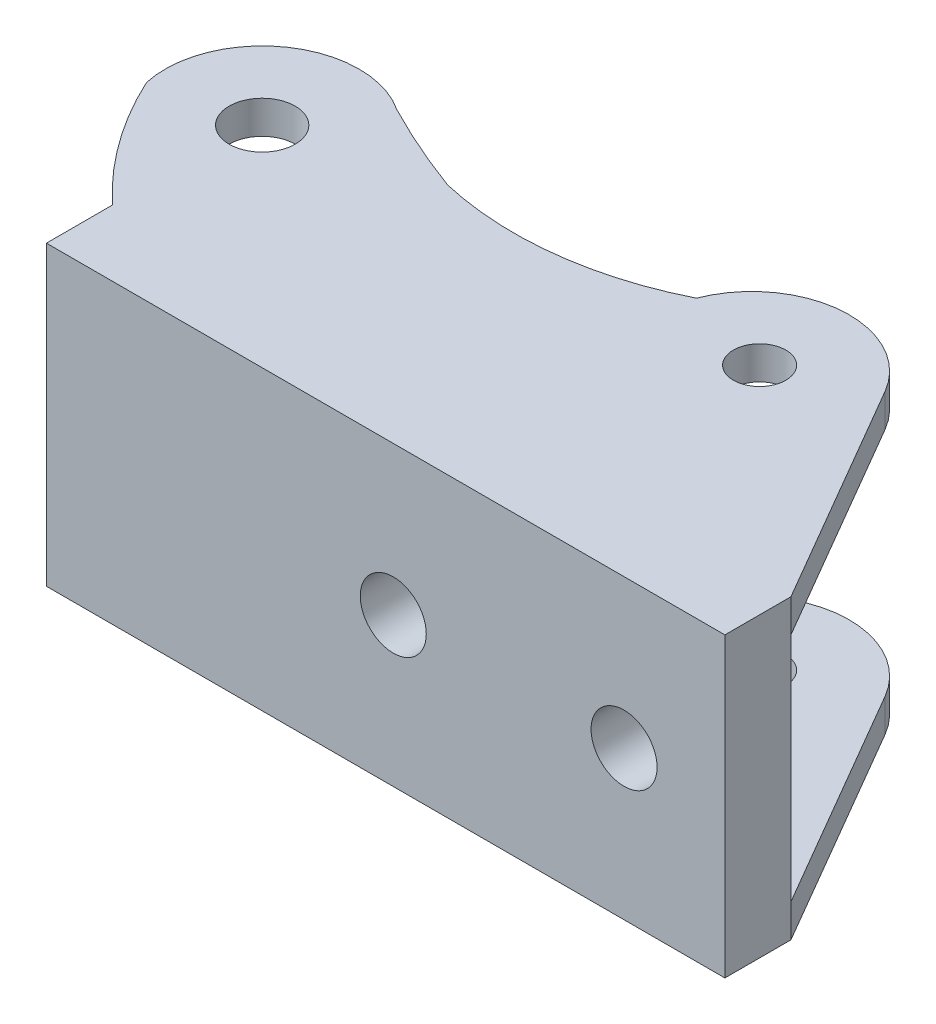
ISO-10303-21;
HEADER;
FILE_DESCRIPTION(('STEP AP214'),'2;1');
FILE_NAME('part.step','',(''),(''),'','','');
FILE_SCHEMA(('AUTOMOTIVE_DESIGN { 1 0 10303 214 1 1 1 1 }'));
ENDSEC;
DATA;
#1=APPLICATION_CONTEXT('core data for automotive mechanical design processes');
#2=APPLICATION_PROTOCOL_DEFINITION('international standard','automotive_design',2000,#1);
#3=PRODUCT_CONTEXT('',#1,'mechanical');
#4=PRODUCT('Part','Part','',(#3));
#5=PRODUCT_RELATED_PRODUCT_CATEGORY('part','',(#4));
#6=PRODUCT_DEFINITION_FORMATION('','',#4);
#7=PRODUCT_DEFINITION_CONTEXT('part definition',#1,'design');
#8=PRODUCT_DEFINITION('design','',#6,#7);
#9=PRODUCT_DEFINITION_SHAPE('','',#8);
#10=(LENGTH_UNIT() NAMED_UNIT(*) SI_UNIT(.MILLI.,.METRE.));
#11=(NAMED_UNIT(*) PLANE_ANGLE_UNIT() SI_UNIT($,.RADIAN.));
#12=(NAMED_UNIT(*) SI_UNIT($,.STERADIAN.) SOLID_ANGLE_UNIT());
#13=UNCERTAINTY_MEASURE_WITH_UNIT(LENGTH_MEASURE(1.E-05),#10,'distance_accuracy_value','');
#14=(GEOMETRIC_REPRESENTATION_CONTEXT(3) GLOBAL_UNCERTAINTY_ASSIGNED_CONTEXT((#13)) GLOBAL_UNIT_ASSIGNED_CONTEXT((#10,
#11,#12)) REPRESENTATION_CONTEXT('',''));
#15=CARTESIAN_POINT('',(0.,0.,0.));
#16=DIRECTION('',(0.,0.,1.));
#17=DIRECTION('',(1.,0.,0.));
#18=AXIS2_PLACEMENT_3D('',#15,#16,#17);
#19=CARTESIAN_POINT('',(0.,0.,10.));
#20=DIRECTION('',(0.,0.,-1.));
#21=DIRECTION('',(-1.,0.,0.));
#22=AXIS2_PLACEMENT_3D('',#19,#20,#21);
#23=PLANE('',#22);
#24=DIRECTION('',(0.,-1.,0.));
#25=VECTOR('',#24,1.);
#26=CARTESIAN_POINT('',(-70.,-22.5,10.));
#27=LINE('',#26,#25);
#28=CARTESIAN_POINT('',(-70.,22.5,10.));
#29=VERTEX_POINT('',#28);
#30=CARTESIAN_POINT('',(-70.,-22.5,10.));
#31=VERTEX_POINT('',#30);
#32=EDGE_CURVE('E62',#29,#31,#27,.T.);
#33=ORIENTED_EDGE('',*,*,#32,.T.);
#34=DIRECTION('',(1.,0.,0.));
#35=VECTOR('',#34,1.);
#36=CARTESIAN_POINT('',(32.7413623701842,-22.5,10.));
#37=LINE('',#36,#35);
#38=CARTESIAN_POINT('',(32.7413623701842,-22.5,10.));
#39=VERTEX_POINT('',#38);
#40=EDGE_CURVE('E117',#31,#39,#37,.T.);
#41=ORIENTED_EDGE('',*,*,#40,.T.);
#42=DIRECTION('',(0.,1.,0.));
#43=VECTOR('',#42,1.);
#44=CARTESIAN_POINT('',(32.7413623701842,22.5,10.));
#45=LINE('',#44,#43);
#46=CARTESIAN_POINT('',(32.7413623701842,22.5,10.));
#47=VERTEX_POINT('',#46);
#48=EDGE_CURVE('E110',#39,#47,#45,.T.);
#49=ORIENTED_EDGE('',*,*,#48,.T.);
#50=DIRECTION('',(-1.,0.,0.));
#51=VECTOR('',#50,1.);
#52=CARTESIAN_POINT('',(-70.,22.5,10.));
#53=LINE('',#52,#51);
#54=EDGE_CURVE('E114',#47,#29,#53,.T.);
#55=ORIENTED_EDGE('',*,*,#54,.T.);
#56=EDGE_LOOP('',(#33,#41,#49,#55));
#57=FACE_BOUND('',#56,.T.);
#58=CARTESIAN_POINT('',(-17.475,0.,10.));
#59=DIRECTION('',(0.,0.,1.));
#60=DIRECTION('',(1.,0.,0.));
#61=AXIS2_PLACEMENT_3D('',#58,#59,#60);
#62=CIRCLE('',#61,5.);
#63=CARTESIAN_POINT('',(-12.475,0.,10.));
#64=VERTEX_POINT('',#63);
#65=EDGE_CURVE('E160',#64,#64,#62,.T.);
#66=ORIENTED_EDGE('',*,*,#65,.F.);
#67=EDGE_LOOP('',(#66));
#68=FACE_BOUND('',#67,.T.);
#69=CARTESIAN_POINT('',(17.475,0.,10.));
#70=DIRECTION('',(0.,0.,1.));
#71=DIRECTION('',(1.,0.,0.));
#72=AXIS2_PLACEMENT_3D('',#69,#70,#71);
#73=CIRCLE('',#72,5.);
#74=CARTESIAN_POINT('',(22.475,0.,10.));
#75=VERTEX_POINT('',#74);
#76=EDGE_CURVE('E161',#75,#75,#73,.T.);
#77=ORIENTED_EDGE('',*,*,#76,.F.);
#78=EDGE_LOOP('',(#77));
#79=FACE_BOUND('',#78,.T.);
#80=ADVANCED_FACE('F38',(#57,#68,#79),#23,.F.);
#81=CARTESIAN_POINT('',(0.,0.,0.));
#82=DIRECTION('',(0.,0.,-1.));
#83=DIRECTION('',(-1.,0.,0.));
#84=AXIS2_PLACEMENT_3D('',#81,#82,#83);
#85=PLANE('',#84);
#86=DIRECTION('',(1.,0.,0.));
#87=VECTOR('',#86,1.);
#88=CARTESIAN_POINT('',(0.,-17.5,0.));
#89=LINE('',#88,#87);
#90=CARTESIAN_POINT('',(-70.,-17.5,0.));
#91=VERTEX_POINT('',#90);
#92=CARTESIAN_POINT('',(32.7413623701842,-17.5,0.));
#93=VERTEX_POINT('',#92);
#94=EDGE_CURVE('E223',#91,#93,#89,.T.);
#95=ORIENTED_EDGE('',*,*,#94,.F.);
#96=DIRECTION('',(0.,-1.,0.));
#97=VECTOR('',#96,1.);
#98=CARTESIAN_POINT('',(-70.,-22.5,0.));
#99=LINE('',#98,#97);
#100=CARTESIAN_POINT('',(-70.,17.5,0.));
#101=VERTEX_POINT('',#100);
#102=EDGE_CURVE('E142',#101,#91,#99,.T.);
#103=ORIENTED_EDGE('',*,*,#102,.F.);
#104=DIRECTION('',(-1.,0.,0.));
#105=VECTOR('',#104,1.);
#106=CARTESIAN_POINT('',(0.,17.5,0.));
#107=LINE('',#106,#105);
#108=CARTESIAN_POINT('',(32.7413623701842,17.5,0.));
#109=VERTEX_POINT('',#108);
#110=EDGE_CURVE('E167',#109,#101,#107,.T.);
#111=ORIENTED_EDGE('',*,*,#110,.F.);
#112=DIRECTION('',(0.,1.,0.));
#113=VECTOR('',#112,1.);
#114=CARTESIAN_POINT('',(32.7413623701842,22.5,0.));
#115=LINE('',#114,#113);
#116=EDGE_CURVE('E143',#93,#109,#115,.T.);
#117=ORIENTED_EDGE('',*,*,#116,.F.);
#118=EDGE_LOOP('',(#95,#103,#111,#117));
#119=FACE_BOUND('',#118,.T.);
#120=CARTESIAN_POINT('',(-17.475,0.,0.));
#121=DIRECTION('',(0.,0.,1.));
#122=DIRECTION('',(1.,0.,0.));
#123=AXIS2_PLACEMENT_3D('',#120,#121,#122);
#124=CIRCLE('',#123,5.);
#125=CARTESIAN_POINT('',(-12.475,0.,0.));
#126=VERTEX_POINT('',#125);
#127=EDGE_CURVE('E157',#126,#126,#124,.T.);
#128=ORIENTED_EDGE('',*,*,#127,.T.);
#129=EDGE_LOOP('',(#128));
#130=FACE_BOUND('',#129,.T.);
#131=CARTESIAN_POINT('',(17.475,0.,0.));
#132=DIRECTION('',(0.,0.,1.));
#133=DIRECTION('',(1.,0.,0.));
#134=AXIS2_PLACEMENT_3D('',#131,#132,#133);
#135=CIRCLE('',#134,5.);
#136=CARTESIAN_POINT('',(22.475,0.,0.));
#137=VERTEX_POINT('',#136);
#138=EDGE_CURVE('E164',#137,#137,#135,.T.);
#139=ORIENTED_EDGE('',*,*,#138,.T.);
#140=EDGE_LOOP('',(#139));
#141=FACE_BOUND('',#140,.T.);
#142=ADVANCED_FACE('F313',(#119,#130,#141),#85,.T.);
#143=CARTESIAN_POINT('',(32.7413623701842,-22.5,10.));
#144=DIRECTION('',(0.,1.,0.));
#145=DIRECTION('',(0.,0.,1.));
#146=AXIS2_PLACEMENT_3D('',#143,#144,#145);
#147=PLANE('',#146);
#148=DIRECTION('',(0.,0.,-1.));
#149=VECTOR('',#148,1.);
#150=CARTESIAN_POINT('',(-70.,-22.5,10.));
#151=LINE('',#150,#149);
#152=CARTESIAN_POINT('',(-70.,-22.5,0.));
#153=VERTEX_POINT('',#152);
#154=EDGE_CURVE('E135',#31,#153,#151,.T.);
#155=ORIENTED_EDGE('',*,*,#154,.T.);
#156=CARTESIAN_POINT('',(-29.033773091917,-22.5,-43.8379772904209));
#157=DIRECTION('',(0.,1.,0.));
#158=DIRECTION('',(0.,0.,-1.));
#159=AXIS2_PLACEMENT_3D('',#156,#157,#158);
#160=CIRCLE('',#159,60.);
#161=CARTESIAN_POINT('',(-83.493041421276,-22.5,-18.6548858791014));
#162=VERTEX_POINT('',#161);
#163=EDGE_CURVE('E75',#162,#153,#160,.T.);
#164=ORIENTED_EDGE('',*,*,#163,.F.);
#165=CARTESIAN_POINT('',(-69.1356503678922,-22.5,-21.8099536763849));
#166=DIRECTION('',(0.,1.,0.));
#167=DIRECTION('',(0.,0.,-1.));
#168=AXIS2_PLACEMENT_3D('',#165,#166,#167);
#169=CIRCLE('',#168,14.6999704307608);
#170=CARTESIAN_POINT('',(-60.9969388294074,-22.5,-34.0512977675611));
#171=VERTEX_POINT('',#170);
#172=EDGE_CURVE('E257',#171,#162,#169,.T.);
#173=ORIENTED_EDGE('',*,*,#172,.F.);
#174=CARTESIAN_POINT('',(-5.78861808199234,-22.5,-140.962108398092));
#175=DIRECTION('',(0.,-1.,0.));
#176=DIRECTION('',(0.,0.,1.));
#177=AXIS2_PLACEMENT_3D('',#174,#175,#176);
#178=CIRCLE('',#177,120.324062886135);
#179=CARTESIAN_POINT('',(-47.2306520051049,-22.5,-28.));
#180=VERTEX_POINT('',#179);
#181=EDGE_CURVE('E254',#180,#171,#178,.T.);
#182=ORIENTED_EDGE('',*,*,#181,.F.);
#183=CARTESIAN_POINT('',(-35.952206015475,-22.5,-76.7113606467629));
#184=DIRECTION('',(0.,-1.,0.));
#185=DIRECTION('',(0.,0.,1.));
#186=AXIS2_PLACEMENT_3D('',#183,#184,#185);
#187=CIRCLE('',#186,50.);
#188=CARTESIAN_POINT('',(-13.5715396019139,-22.5,-32.));
#189=VERTEX_POINT('',#188);
#190=EDGE_CURVE('E251',#189,#180,#187,.T.);
#191=ORIENTED_EDGE('',*,*,#190,.F.);
#192=CARTESIAN_POINT('',(0.179908217906623,-22.5,-26.6307273203205));
#193=DIRECTION('',(0.,1.,0.));
#194=DIRECTION('',(0.,0.,1.));
#195=AXIS2_PLACEMENT_3D('',#192,#193,#194);
#196=CIRCLE('',#195,14.7625);
#197=CARTESIAN_POINT('',(12.9418258045211,-22.5,-34.0512977675611));
#198=VERTEX_POINT('',#197);
#199=EDGE_CURVE('E248',#198,#189,#196,.T.);
#200=ORIENTED_EDGE('',*,*,#199,.F.);
#201=DIRECTION('',(-0.50266353579953,0.,-0.864482139652124));
#202=VECTOR('',#201,1.);
#203=CARTESIAN_POINT('',(32.7413623701842,-22.5,0.));
#204=LINE('',#203,#202);
#205=CARTESIAN_POINT('',(32.7413623701842,-22.5,0.));
#206=VERTEX_POINT('',#205);
#207=EDGE_CURVE('E244',#206,#198,#204,.T.);
#208=ORIENTED_EDGE('',*,*,#207,.F.);
#209=DIRECTION('',(0.,0.,-1.));
#210=VECTOR('',#209,1.);
#211=CARTESIAN_POINT('',(32.7413623701842,-22.5,10.));
#212=LINE('',#211,#210);
#213=EDGE_CURVE('E11',#39,#206,#212,.T.);
#214=ORIENTED_EDGE('',*,*,#213,.F.);
#215=ORIENTED_EDGE('',*,*,#40,.F.);
#216=EDGE_LOOP('',(#155,#164,#173,#182,#191,#200,#208,#214,#215));
#217=FACE_BOUND('',#216,.T.);
#218=CARTESIAN_POINT('',(0.,-22.5,-28.));
#219=DIRECTION('',(0.,1.,0.));
#220=DIRECTION('',(0.,0.,1.));
#221=AXIS2_PLACEMENT_3D('',#218,#219,#220);
#222=CIRCLE('',#221,3.96875);
#223=CARTESIAN_POINT('',(0.,-22.5,-24.03125));
#224=VERTEX_POINT('',#223);
#225=EDGE_CURVE('E278',#224,#224,#222,.T.);
#226=ORIENTED_EDGE('',*,*,#225,.T.);
#227=EDGE_LOOP('',(#226));
#228=FACE_BOUND('',#227,.T.);
#229=CARTESIAN_POINT('',(-69.1356503678922,-22.5,-21.8099536763849));
#230=DIRECTION('',(0.,1.,0.));
#231=DIRECTION('',(0.,0.,1.));
#232=AXIS2_PLACEMENT_3D('',#229,#230,#231);
#233=CIRCLE('',#232,5.00000000000002);
#234=CARTESIAN_POINT('',(-69.1356503678922,-22.5,-16.8099536763849));
#235=VERTEX_POINT('',#234);
#236=EDGE_CURVE('E284',#235,#235,#233,.T.);
#237=ORIENTED_EDGE('',*,*,#236,.T.);
#238=EDGE_LOOP('',(#237));
#239=FACE_BOUND('',#238,.T.);
#240=ADVANCED_FACE('F40',(#217,#228,#239),#147,.F.);
#241=CARTESIAN_POINT('',(32.7413623701842,22.5,10.));
#242=DIRECTION('',(-1.,0.,0.));
#243=DIRECTION('',(0.,0.,1.));
#244=AXIS2_PLACEMENT_3D('',#241,#242,#243);
#245=PLANE('',#244);
#246=DIRECTION('',(0.,0.,-1.));
#247=VECTOR('',#246,1.);
#248=CARTESIAN_POINT('',(32.7413623701842,22.5,10.));
#249=LINE('',#248,#247);
#250=CARTESIAN_POINT('',(32.7413623701842,22.5,0.));
#251=VERTEX_POINT('',#250);
#252=EDGE_CURVE('E46',#47,#251,#249,.T.);
#253=ORIENTED_EDGE('',*,*,#252,.F.);
#254=ORIENTED_EDGE('',*,*,#48,.F.);
#255=ORIENTED_EDGE('',*,*,#213,.T.);
#256=EDGE_CURVE('E139',#206,#93,#115,.T.);
#257=ORIENTED_EDGE('',*,*,#256,.T.);
#258=ORIENTED_EDGE('',*,*,#116,.T.);
#259=DIRECTION('',(0.,1.,0.));
#260=VECTOR('',#259,1.);
#261=CARTESIAN_POINT('',(32.7413623701842,17.5,0.));
#262=LINE('',#261,#260);
#263=EDGE_CURVE('E126',#109,#251,#262,.T.);
#264=ORIENTED_EDGE('',*,*,#263,.T.);
#265=EDGE_LOOP('',(#253,#254,#255,#257,#258,#264));
#266=FACE_BOUND('',#265,.T.);
#267=ADVANCED_FACE('F123',(#266),#245,.F.);
#268=CARTESIAN_POINT('',(-70.,22.5,10.));
#269=DIRECTION('',(0.,-1.,0.));
#270=DIRECTION('',(0.,0.,-1.));
#271=AXIS2_PLACEMENT_3D('',#268,#269,#270);
#272=PLANE('',#271);
#273=ORIENTED_EDGE('',*,*,#252,.T.);
#274=DIRECTION('',(-0.50266353579953,0.,-0.864482139652124));
#275=VECTOR('',#274,1.);
#276=CARTESIAN_POINT('',(32.7413623701842,22.5,0.));
#277=LINE('',#276,#275);
#278=CARTESIAN_POINT('',(12.9418258045211,22.5,-34.0512977675611));
#279=VERTEX_POINT('',#278);
#280=EDGE_CURVE('E194',#251,#279,#277,.T.);
#281=ORIENTED_EDGE('',*,*,#280,.T.);
#282=CARTESIAN_POINT('',(0.179908217906623,22.5,-26.6307273203205));
#283=DIRECTION('',(0.,1.,0.));
#284=DIRECTION('',(0.,0.,1.));
#285=AXIS2_PLACEMENT_3D('',#282,#283,#284);
#286=CIRCLE('',#285,14.7625);
#287=CARTESIAN_POINT('',(-13.5715396019139,22.5,-32.));
#288=VERTEX_POINT('',#287);
#289=EDGE_CURVE('E191',#279,#288,#286,.T.);
#290=ORIENTED_EDGE('',*,*,#289,.T.);
#291=CARTESIAN_POINT('',(-35.952206015475,22.5,-76.7113606467629));
#292=DIRECTION('',(0.,-1.,0.));
#293=DIRECTION('',(0.,0.,1.));
#294=AXIS2_PLACEMENT_3D('',#291,#292,#293);
#295=CIRCLE('',#294,50.);
#296=CARTESIAN_POINT('',(-47.2306520051049,22.5,-28.));
#297=VERTEX_POINT('',#296);
#298=EDGE_CURVE('E188',#288,#297,#295,.T.);
#299=ORIENTED_EDGE('',*,*,#298,.T.);
#300=CARTESIAN_POINT('',(-5.78861808199234,22.5,-140.962108398092));
#301=DIRECTION('',(0.,-1.,0.));
#302=DIRECTION('',(0.,0.,1.));
#303=AXIS2_PLACEMENT_3D('',#300,#301,#302);
#304=CIRCLE('',#303,120.324062886135);
#305=CARTESIAN_POINT('',(-60.9969388294074,22.5,-34.0512977675611));
#306=VERTEX_POINT('',#305);
#307=EDGE_CURVE('E185',#297,#306,#304,.T.);
#308=ORIENTED_EDGE('',*,*,#307,.T.);
#309=CARTESIAN_POINT('',(-69.1356503678922,22.5,-21.8099536763849));
#310=DIRECTION('',(0.,1.,0.));
#311=DIRECTION('',(0.,0.,-1.));
#312=AXIS2_PLACEMENT_3D('',#309,#310,#311);
#313=CIRCLE('',#312,14.6999704307608);
#314=CARTESIAN_POINT('',(-83.493041421276,22.5,-18.6548858791014));
#315=VERTEX_POINT('',#314);
#316=EDGE_CURVE('E182',#306,#315,#313,.T.);
#317=ORIENTED_EDGE('',*,*,#316,.T.);
#318=CARTESIAN_POINT('',(-29.033773091917,22.5,-43.8379772904209));
#319=DIRECTION('',(0.,1.,0.));
#320=DIRECTION('',(0.,0.,-1.));
#321=AXIS2_PLACEMENT_3D('',#318,#319,#320);
#322=CIRCLE('',#321,60.);
#323=CARTESIAN_POINT('',(-70.,22.5,0.));
#324=VERTEX_POINT('',#323);
#325=EDGE_CURVE('E196',#315,#324,#322,.T.);
#326=ORIENTED_EDGE('',*,*,#325,.T.);
#327=DIRECTION('',(0.,0.,-1.));
#328=VECTOR('',#327,1.);
#329=CARTESIAN_POINT('',(-70.,22.5,10.));
#330=LINE('',#329,#328);
#331=EDGE_CURVE('E129',#29,#324,#330,.T.);
#332=ORIENTED_EDGE('',*,*,#331,.F.);
#333=ORIENTED_EDGE('',*,*,#54,.F.);
#334=EDGE_LOOP('',(#273,#281,#290,#299,#308,#317,#326,#332,#333));
#335=FACE_BOUND('',#334,.T.);
#336=CARTESIAN_POINT('',(-69.1356503678922,22.5,-21.8099536763849));
#337=DIRECTION('',(0.,1.,0.));
#338=DIRECTION('',(0.,0.,1.));
#339=AXIS2_PLACEMENT_3D('',#336,#337,#338);
#340=CIRCLE('',#339,5.00000000000002);
#341=CARTESIAN_POINT('',(-69.1356503678922,22.5,-16.8099536763849));
#342=VERTEX_POINT('',#341);
#343=EDGE_CURVE('E220',#342,#342,#340,.T.);
#344=ORIENTED_EDGE('',*,*,#343,.F.);
#345=EDGE_LOOP('',(#344));
#346=FACE_BOUND('',#345,.T.);
#347=CARTESIAN_POINT('',(0.,22.5,-28.));
#348=DIRECTION('',(0.,1.,0.));
#349=DIRECTION('',(0.,0.,1.));
#350=AXIS2_PLACEMENT_3D('',#347,#348,#349);
#351=CIRCLE('',#350,3.96875);
#352=CARTESIAN_POINT('',(0.,22.5,-24.03125));
#353=VERTEX_POINT('',#352);
#354=EDGE_CURVE('E214',#353,#353,#351,.T.);
#355=ORIENTED_EDGE('',*,*,#354,.F.);
#356=EDGE_LOOP('',(#355));
#357=FACE_BOUND('',#356,.T.);
#358=ADVANCED_FACE('F130',(#335,#346,#357),#272,.F.);
#359=CARTESIAN_POINT('',(-70.,-22.5,10.));
#360=DIRECTION('',(1.,0.,0.));
#361=DIRECTION('',(0.,0.,-1.));
#362=AXIS2_PLACEMENT_3D('',#359,#360,#361);
#363=PLANE('',#362);
#364=ORIENTED_EDGE('',*,*,#102,.T.);
#365=DIRECTION('',(0.,-1.,0.));
#366=VECTOR('',#365,1.);
#367=CARTESIAN_POINT('',(-70.,-17.5,0.));
#368=LINE('',#367,#366);
#369=EDGE_CURVE('E152',#91,#153,#368,.T.);
#370=ORIENTED_EDGE('',*,*,#369,.T.);
#371=ORIENTED_EDGE('',*,*,#154,.F.);
#372=ORIENTED_EDGE('',*,*,#32,.F.);
#373=ORIENTED_EDGE('',*,*,#331,.T.);
#374=EDGE_CURVE('E144',#324,#101,#99,.T.);
#375=ORIENTED_EDGE('',*,*,#374,.T.);
#376=EDGE_LOOP('',(#364,#370,#371,#372,#373,#375));
#377=FACE_BOUND('',#376,.T.);
#378=ADVANCED_FACE('F151',(#377),#363,.F.);
#379=CARTESIAN_POINT('',(-17.475,0.,10.));
#380=DIRECTION('',(0.,0.,-1.));
#381=DIRECTION('',(-1.,0.,0.));
#382=AXIS2_PLACEMENT_3D('',#379,#380,#381);
#383=CYLINDRICAL_SURFACE('',#382,5.);
#384=ORIENTED_EDGE('',*,*,#65,.T.);
#385=EDGE_LOOP('',(#384));
#386=FACE_BOUND('',#385,.T.);
#387=ORIENTED_EDGE('',*,*,#127,.F.);
#388=EDGE_LOOP('',(#387));
#389=FACE_BOUND('',#388,.T.);
#390=ADVANCED_FACE('F321',(#386,#389),#383,.F.);
#391=CARTESIAN_POINT('',(17.475,0.,10.));
#392=DIRECTION('',(0.,0.,-1.));
#393=DIRECTION('',(-1.,0.,0.));
#394=AXIS2_PLACEMENT_3D('',#391,#392,#393);
#395=CYLINDRICAL_SURFACE('',#394,5.);
#396=ORIENTED_EDGE('',*,*,#76,.T.);
#397=EDGE_LOOP('',(#396));
#398=FACE_BOUND('',#397,.T.);
#399=ORIENTED_EDGE('',*,*,#138,.F.);
#400=EDGE_LOOP('',(#399));
#401=FACE_BOUND('',#400,.T.);
#402=ADVANCED_FACE('F427',(#398,#401),#395,.F.);
#403=CARTESIAN_POINT('',(-29.033773091917,17.5,-43.8379772904209));
#404=DIRECTION('',(0.,1.,0.));
#405=DIRECTION('',(0.,0.,1.));
#406=AXIS2_PLACEMENT_3D('',#403,#404,#405);
#407=CYLINDRICAL_SURFACE('',#406,60.);
#408=ORIENTED_EDGE('',*,*,#325,.F.);
#409=DIRECTION('',(0.,1.,0.));
#410=VECTOR('',#409,1.);
#411=CARTESIAN_POINT('',(-83.493041421276,17.5,-18.6548858791014));
#412=LINE('',#411,#410);
#413=CARTESIAN_POINT('',(-83.493041421276,17.5,-18.6548858791014));
#414=VERTEX_POINT('',#413);
#415=EDGE_CURVE('E83',#414,#315,#412,.T.);
#416=ORIENTED_EDGE('',*,*,#415,.F.);
#417=CARTESIAN_POINT('',(-29.033773091917,17.5,-43.8379772904209));
#418=DIRECTION('',(0.,1.,0.));
#419=DIRECTION('',(0.,0.,-1.));
#420=AXIS2_PLACEMENT_3D('',#417,#418,#419);
#421=CIRCLE('',#420,60.);
#422=EDGE_CURVE('E53',#414,#101,#421,.T.);
#423=ORIENTED_EDGE('',*,*,#422,.T.);
#424=ORIENTED_EDGE('',*,*,#374,.F.);
#425=EDGE_LOOP('',(#408,#416,#423,#424));
#426=FACE_BOUND('',#425,.T.);
#427=ADVANCED_FACE('F417',(#426),#407,.T.);
#428=CARTESIAN_POINT('',(-69.1356503678922,17.5,-21.8099536763849));
#429=DIRECTION('',(0.,1.,0.));
#430=DIRECTION('',(0.,0.,1.));
#431=AXIS2_PLACEMENT_3D('',#428,#429,#430);
#432=CYLINDRICAL_SURFACE('',#431,14.6999704307608);
#433=ORIENTED_EDGE('',*,*,#316,.F.);
#434=DIRECTION('',(0.,1.,0.));
#435=VECTOR('',#434,1.);
#436=CARTESIAN_POINT('',(-60.9969388294074,17.5,-34.0512977675611));
#437=LINE('',#436,#435);
#438=CARTESIAN_POINT('',(-60.9969388294074,17.5,-34.0512977675611));
#439=VERTEX_POINT('',#438);
#440=EDGE_CURVE('E179',#439,#306,#437,.T.);
#441=ORIENTED_EDGE('',*,*,#440,.F.);
#442=CARTESIAN_POINT('',(-69.1356503678922,17.5,-21.8099536763849));
#443=DIRECTION('',(0.,1.,0.));
#444=DIRECTION('',(0.,0.,-1.));
#445=AXIS2_PLACEMENT_3D('',#442,#443,#444);
#446=CIRCLE('',#445,14.6999704307608);
#447=EDGE_CURVE('E173',#439,#414,#446,.T.);
#448=ORIENTED_EDGE('',*,*,#447,.T.);
#449=ORIENTED_EDGE('',*,*,#415,.T.);
#450=EDGE_LOOP('',(#433,#441,#448,#449));
#451=FACE_BOUND('',#450,.T.);
#452=ADVANCED_FACE('F407',(#451),#432,.T.);
#453=CARTESIAN_POINT('',(-5.78861808199234,17.5,-140.962108398092));
#454=DIRECTION('',(0.,1.,0.));
#455=DIRECTION('',(0.,0.,1.));
#456=AXIS2_PLACEMENT_3D('',#453,#454,#455);
#457=CYLINDRICAL_SURFACE('',#456,120.324062886135);
#458=ORIENTED_EDGE('',*,*,#307,.F.);
#459=DIRECTION('',(0.,1.,0.));
#460=VECTOR('',#459,1.);
#461=CARTESIAN_POINT('',(-47.2306520051049,17.5,-28.));
#462=LINE('',#461,#460);
#463=CARTESIAN_POINT('',(-47.2306520051049,17.5,-28.));
#464=VERTEX_POINT('',#463);
#465=EDGE_CURVE('E177',#464,#297,#462,.T.);
#466=ORIENTED_EDGE('',*,*,#465,.F.);
#467=CARTESIAN_POINT('',(-5.78861808199234,17.5,-140.962108398092));
#468=DIRECTION('',(0.,-1.,0.));
#469=DIRECTION('',(0.,0.,1.));
#470=AXIS2_PLACEMENT_3D('',#467,#468,#469);
#471=CIRCLE('',#470,120.324062886135);
#472=EDGE_CURVE('E201',#464,#439,#471,.T.);
#473=ORIENTED_EDGE('',*,*,#472,.T.);
#474=ORIENTED_EDGE('',*,*,#440,.T.);
#475=EDGE_LOOP('',(#458,#466,#473,#474));
#476=FACE_BOUND('',#475,.T.);
#477=ADVANCED_FACE('F397',(#476),#457,.F.);
#478=CARTESIAN_POINT('',(-35.952206015475,17.5,-76.7113606467629));
#479=DIRECTION('',(0.,1.,0.));
#480=DIRECTION('',(0.,0.,1.));
#481=AXIS2_PLACEMENT_3D('',#478,#479,#480);
#482=CYLINDRICAL_SURFACE('',#481,50.);
#483=ORIENTED_EDGE('',*,*,#298,.F.);
#484=DIRECTION('',(0.,1.,0.));
#485=VECTOR('',#484,1.);
#486=CARTESIAN_POINT('',(-13.5715396019139,17.5,-32.));
#487=LINE('',#486,#485);
#488=CARTESIAN_POINT('',(-13.5715396019139,17.5,-32.));
#489=VERTEX_POINT('',#488);
#490=EDGE_CURVE('E175',#489,#288,#487,.T.);
#491=ORIENTED_EDGE('',*,*,#490,.F.);
#492=CARTESIAN_POINT('',(-35.952206015475,17.5,-76.7113606467629));
#493=DIRECTION('',(0.,-1.,0.));
#494=DIRECTION('',(0.,0.,1.));
#495=AXIS2_PLACEMENT_3D('',#492,#493,#494);
#496=CIRCLE('',#495,50.);
#497=EDGE_CURVE('E204',#489,#464,#496,.T.);
#498=ORIENTED_EDGE('',*,*,#497,.T.);
#499=ORIENTED_EDGE('',*,*,#465,.T.);
#500=EDGE_LOOP('',(#483,#491,#498,#499));
#501=FACE_BOUND('',#500,.T.);
#502=ADVANCED_FACE('F387',(#501),#482,.F.);
#503=CARTESIAN_POINT('',(0.179908217906623,17.5,-26.6307273203205));
#504=DIRECTION('',(0.,1.,0.));
#505=DIRECTION('',(0.,0.,1.));
#506=AXIS2_PLACEMENT_3D('',#503,#504,#505);
#507=CYLINDRICAL_SURFACE('',#506,14.7625);
#508=ORIENTED_EDGE('',*,*,#289,.F.);
#509=DIRECTION('',(0.,1.,0.));
#510=VECTOR('',#509,1.);
#511=CARTESIAN_POINT('',(12.9418258045211,17.5,-34.0512977675611));
#512=LINE('',#511,#510);
#513=CARTESIAN_POINT('',(12.9418258045211,17.5,-34.0512977675611));
#514=VERTEX_POINT('',#513);
#515=EDGE_CURVE('E172',#514,#279,#512,.T.);
#516=ORIENTED_EDGE('',*,*,#515,.F.);
#517=CARTESIAN_POINT('',(0.179908217906623,17.5,-26.6307273203205));
#518=DIRECTION('',(0.,1.,0.));
#519=DIRECTION('',(0.,0.,1.));
#520=AXIS2_PLACEMENT_3D('',#517,#518,#519);
#521=CIRCLE('',#520,14.7625);
#522=EDGE_CURVE('E207',#514,#489,#521,.T.);
#523=ORIENTED_EDGE('',*,*,#522,.T.);
#524=ORIENTED_EDGE('',*,*,#490,.T.);
#525=EDGE_LOOP('',(#508,#516,#523,#524));
#526=FACE_BOUND('',#525,.T.);
#527=ADVANCED_FACE('F377',(#526),#507,.T.);
#528=CARTESIAN_POINT('',(32.7413623701842,17.5,0.));
#529=DIRECTION('',(0.864482139652124,0.,-0.50266353579953));
#530=DIRECTION('',(-0.50266353579953,0.,-0.864482139652124));
#531=AXIS2_PLACEMENT_3D('',#528,#529,#530);
#532=PLANE('',#531);
#533=ORIENTED_EDGE('',*,*,#280,.F.);
#534=ORIENTED_EDGE('',*,*,#263,.F.);
#535=DIRECTION('',(-0.50266353579953,0.,-0.864482139652124));
#536=VECTOR('',#535,1.);
#537=CARTESIAN_POINT('',(32.7413623701842,17.5,0.));
#538=LINE('',#537,#536);
#539=EDGE_CURVE('E210',#109,#514,#538,.T.);
#540=ORIENTED_EDGE('',*,*,#539,.T.);
#541=ORIENTED_EDGE('',*,*,#515,.T.);
#542=EDGE_LOOP('',(#533,#534,#540,#541));
#543=FACE_BOUND('',#542,.T.);
#544=ADVANCED_FACE('F367',(#543),#532,.T.);
#545=CARTESIAN_POINT('',(-29.033773091917,17.5,-43.8379772904209));
#546=DIRECTION('',(0.,-1.,0.));
#547=DIRECTION('',(0.,0.,-1.));
#548=AXIS2_PLACEMENT_3D('',#545,#546,#547);
#549=PLANE('',#548);
#550=CARTESIAN_POINT('',(-69.1356503678922,17.5,-21.8099536763849));
#551=DIRECTION('',(0.,1.,0.));
#552=DIRECTION('',(0.,0.,1.));
#553=AXIS2_PLACEMENT_3D('',#550,#551,#552);
#554=CIRCLE('',#553,5.00000000000002);
#555=CARTESIAN_POINT('',(-69.1356503678922,17.5,-16.8099536763849));
#556=VERTEX_POINT('',#555);
#557=EDGE_CURVE('E217',#556,#556,#554,.T.);
#558=ORIENTED_EDGE('',*,*,#557,.T.);
#559=EDGE_LOOP('',(#558));
#560=FACE_BOUND('',#559,.T.);
#561=CARTESIAN_POINT('',(0.,17.5,-28.));
#562=DIRECTION('',(0.,1.,0.));
#563=DIRECTION('',(0.,0.,1.));
#564=AXIS2_PLACEMENT_3D('',#561,#562,#563);
#565=CIRCLE('',#564,3.96875);
#566=CARTESIAN_POINT('',(0.,17.5,-24.03125));
#567=VERTEX_POINT('',#566);
#568=EDGE_CURVE('E198',#567,#567,#565,.T.);
#569=ORIENTED_EDGE('',*,*,#568,.T.);
#570=EDGE_LOOP('',(#569));
#571=FACE_BOUND('',#570,.T.);
#572=ORIENTED_EDGE('',*,*,#539,.F.);
#573=ORIENTED_EDGE('',*,*,#110,.T.);
#574=ORIENTED_EDGE('',*,*,#422,.F.);
#575=ORIENTED_EDGE('',*,*,#447,.F.);
#576=ORIENTED_EDGE('',*,*,#472,.F.);
#577=ORIENTED_EDGE('',*,*,#497,.F.);
#578=ORIENTED_EDGE('',*,*,#522,.F.);
#579=EDGE_LOOP('',(#572,#573,#574,#575,#576,#577,#578));
#580=FACE_BOUND('',#579,.T.);
#581=ADVANCED_FACE('F357',(#560,#571,#580),#549,.T.);
#582=CARTESIAN_POINT('',(0.,17.5,-28.));
#583=DIRECTION('',(0.,1.,0.));
#584=DIRECTION('',(0.,0.,1.));
#585=AXIS2_PLACEMENT_3D('',#582,#583,#584);
#586=CYLINDRICAL_SURFACE('',#585,3.96875);
#587=ORIENTED_EDGE('',*,*,#568,.F.);
#588=EDGE_LOOP('',(#587));
#589=FACE_BOUND('',#588,.T.);
#590=ORIENTED_EDGE('',*,*,#354,.T.);
#591=EDGE_LOOP('',(#590));
#592=FACE_BOUND('',#591,.T.);
#593=ADVANCED_FACE('F305',(#589,#592),#586,.F.);
#594=CARTESIAN_POINT('',(-69.1356503678922,17.5,-21.8099536763849));
#595=DIRECTION('',(0.,1.,0.));
#596=DIRECTION('',(0.,0.,1.));
#597=AXIS2_PLACEMENT_3D('',#594,#595,#596);
#598=CYLINDRICAL_SURFACE('',#597,5.00000000000002);
#599=ORIENTED_EDGE('',*,*,#557,.F.);
#600=EDGE_LOOP('',(#599));
#601=FACE_BOUND('',#600,.T.);
#602=ORIENTED_EDGE('',*,*,#343,.T.);
#603=EDGE_LOOP('',(#602));
#604=FACE_BOUND('',#603,.T.);
#605=ADVANCED_FACE('F296',(#601,#604),#598,.F.);
#606=CARTESIAN_POINT('',(-29.033773091917,-17.5,-43.8379772904209));
#607=DIRECTION('',(0.,1.,0.));
#608=DIRECTION('',(0.,0.,-1.));
#609=AXIS2_PLACEMENT_3D('',#606,#607,#608);
#610=PLANE('',#609);
#611=CARTESIAN_POINT('',(0.,-17.5,-28.));
#612=DIRECTION('',(0.,1.,0.));
#613=DIRECTION('',(0.,0.,1.));
#614=AXIS2_PLACEMENT_3D('',#611,#612,#613);
#615=CIRCLE('',#614,3.96875);
#616=CARTESIAN_POINT('',(0.,-17.5,-24.03125));
#617=VERTEX_POINT('',#616);
#618=EDGE_CURVE('E261',#617,#617,#615,.T.);
#619=ORIENTED_EDGE('',*,*,#618,.F.);
#620=EDGE_LOOP('',(#619));
#621=FACE_BOUND('',#620,.T.);
#622=CARTESIAN_POINT('',(-29.033773091917,-17.5,-43.8379772904209));
#623=DIRECTION('',(0.,1.,0.));
#624=DIRECTION('',(0.,0.,-1.));
#625=AXIS2_PLACEMENT_3D('',#622,#623,#624);
#626=CIRCLE('',#625,60.);
#627=CARTESIAN_POINT('',(-83.493041421276,-17.5,-18.6548858791014));
#628=VERTEX_POINT('',#627);
#629=EDGE_CURVE('E247',#628,#91,#626,.T.);
#630=ORIENTED_EDGE('',*,*,#629,.T.);
#631=ORIENTED_EDGE('',*,*,#94,.T.);
#632=DIRECTION('',(-0.50266353579953,0.,-0.864482139652124));
#633=VECTOR('',#632,1.);
#634=CARTESIAN_POINT('',(32.7413623701842,-17.5,0.));
#635=LINE('',#634,#633);
#636=CARTESIAN_POINT('',(12.9418258045211,-17.5,-34.0512977675611));
#637=VERTEX_POINT('',#636);
#638=EDGE_CURVE('E231',#93,#637,#635,.T.);
#639=ORIENTED_EDGE('',*,*,#638,.T.);
#640=CARTESIAN_POINT('',(0.179908217906623,-17.5,-26.6307273203205));
#641=DIRECTION('',(0.,1.,0.));
#642=DIRECTION('',(0.,0.,1.));
#643=AXIS2_PLACEMENT_3D('',#640,#641,#642);
#644=CIRCLE('',#643,14.7625);
#645=CARTESIAN_POINT('',(-13.5715396019139,-17.5,-32.));
#646=VERTEX_POINT('',#645);
#647=EDGE_CURVE('E264',#637,#646,#644,.T.);
#648=ORIENTED_EDGE('',*,*,#647,.T.);
#649=CARTESIAN_POINT('',(-35.952206015475,-17.5,-76.7113606467629));
#650=DIRECTION('',(0.,-1.,0.));
#651=DIRECTION('',(0.,0.,1.));
#652=AXIS2_PLACEMENT_3D('',#649,#650,#651);
#653=CIRCLE('',#652,50.);
#654=CARTESIAN_POINT('',(-47.2306520051049,-17.5,-28.));
#655=VERTEX_POINT('',#654);
#656=EDGE_CURVE('E267',#646,#655,#653,.T.);
#657=ORIENTED_EDGE('',*,*,#656,.T.);
#658=CARTESIAN_POINT('',(-5.78861808199234,-17.5,-140.962108398092));
#659=DIRECTION('',(0.,-1.,0.));
#660=DIRECTION('',(0.,0.,1.));
#661=AXIS2_PLACEMENT_3D('',#658,#659,#660);
#662=CIRCLE('',#661,120.324062886135);
#663=CARTESIAN_POINT('',(-60.9969388294074,-17.5,-34.0512977675611));
#664=VERTEX_POINT('',#663);
#665=EDGE_CURVE('E270',#655,#664,#662,.T.);
#666=ORIENTED_EDGE('',*,*,#665,.T.);
#667=CARTESIAN_POINT('',(-69.1356503678922,-17.5,-21.8099536763849));
#668=DIRECTION('',(0.,1.,0.));
#669=DIRECTION('',(0.,0.,-1.));
#670=AXIS2_PLACEMENT_3D('',#667,#668,#669);
#671=CIRCLE('',#670,14.6999704307608);
#672=EDGE_CURVE('E273',#664,#628,#671,.T.);
#673=ORIENTED_EDGE('',*,*,#672,.T.);
#674=EDGE_LOOP('',(#630,#631,#639,#648,#657,#666,#673));
#675=FACE_BOUND('',#674,.T.);
#676=CARTESIAN_POINT('',(-69.1356503678922,-17.5,-21.8099536763849));
#677=DIRECTION('',(0.,1.,0.));
#678=DIRECTION('',(0.,0.,1.));
#679=AXIS2_PLACEMENT_3D('',#676,#677,#678);
#680=CIRCLE('',#679,5.00000000000002);
#681=CARTESIAN_POINT('',(-69.1356503678922,-17.5,-16.8099536763849));
#682=VERTEX_POINT('',#681);
#683=EDGE_CURVE('E281',#682,#682,#680,.T.);
#684=ORIENTED_EDGE('',*,*,#683,.F.);
#685=EDGE_LOOP('',(#684));
#686=FACE_BOUND('',#685,.T.);
#687=ADVANCED_FACE('F293',(#621,#675,#686),#610,.T.);
#688=CARTESIAN_POINT('',(-29.033773091917,-17.5,-43.8379772904209));
#689=DIRECTION('',(0.,-1.,0.));
#690=DIRECTION('',(0.,0.,-1.));
#691=AXIS2_PLACEMENT_3D('',#688,#689,#690);
#692=CYLINDRICAL_SURFACE('',#691,60.);
#693=ORIENTED_EDGE('',*,*,#163,.T.);
#694=ORIENTED_EDGE('',*,*,#369,.F.);
#695=ORIENTED_EDGE('',*,*,#629,.F.);
#696=DIRECTION('',(0.,-1.,0.));
#697=VECTOR('',#696,1.);
#698=CARTESIAN_POINT('',(-83.493041421276,-17.5,-18.6548858791014));
#699=LINE('',#698,#697);
#700=EDGE_CURVE('E228',#628,#162,#699,.T.);
#701=ORIENTED_EDGE('',*,*,#700,.T.);
#702=EDGE_LOOP('',(#693,#694,#695,#701));
#703=FACE_BOUND('',#702,.T.);
#704=ADVANCED_FACE('F295',(#703),#692,.T.);
#705=CARTESIAN_POINT('',(32.7413623701842,-17.5,0.));
#706=DIRECTION('',(-0.864482139652124,0.,0.50266353579953));
#707=DIRECTION('',(0.50266353579953,0.,0.864482139652124));
#708=AXIS2_PLACEMENT_3D('',#705,#706,#707);
#709=PLANE('',#708);
#710=ORIENTED_EDGE('',*,*,#207,.T.);
#711=DIRECTION('',(0.,-1.,0.));
#712=VECTOR('',#711,1.);
#713=CARTESIAN_POINT('',(12.9418258045211,-17.5,-34.0512977675611));
#714=LINE('',#713,#712);
#715=EDGE_CURVE('E240',#637,#198,#714,.T.);
#716=ORIENTED_EDGE('',*,*,#715,.F.);
#717=ORIENTED_EDGE('',*,*,#638,.F.);
#718=ORIENTED_EDGE('',*,*,#256,.F.);
#719=EDGE_LOOP('',(#710,#716,#717,#718));
#720=FACE_BOUND('',#719,.T.);
#721=ADVANCED_FACE('F303',(#720),#709,.F.);
#722=CARTESIAN_POINT('',(0.179908217906623,-17.5,-26.6307273203205));
#723=DIRECTION('',(0.,-1.,0.));
#724=DIRECTION('',(0.,0.,-1.));
#725=AXIS2_PLACEMENT_3D('',#722,#723,#724);
#726=CYLINDRICAL_SURFACE('',#725,14.7625);
#727=ORIENTED_EDGE('',*,*,#199,.T.);
#728=DIRECTION('',(0.,-1.,0.));
#729=VECTOR('',#728,1.);
#730=CARTESIAN_POINT('',(-13.5715396019139,-17.5,-32.));
#731=LINE('',#730,#729);
#732=EDGE_CURVE('E237',#646,#189,#731,.T.);
#733=ORIENTED_EDGE('',*,*,#732,.F.);
#734=ORIENTED_EDGE('',*,*,#647,.F.);
#735=ORIENTED_EDGE('',*,*,#715,.T.);
#736=EDGE_LOOP('',(#727,#733,#734,#735));
#737=FACE_BOUND('',#736,.T.);
#738=ADVANCED_FACE('F477',(#737),#726,.T.);
#739=CARTESIAN_POINT('',(-35.952206015475,-17.5,-76.7113606467629));
#740=DIRECTION('',(0.,-1.,0.));
#741=DIRECTION('',(0.,0.,-1.));
#742=AXIS2_PLACEMENT_3D('',#739,#740,#741);
#743=CYLINDRICAL_SURFACE('',#742,50.);
#744=ORIENTED_EDGE('',*,*,#190,.T.);
#745=DIRECTION('',(0.,-1.,0.));
#746=VECTOR('',#745,1.);
#747=CARTESIAN_POINT('',(-47.2306520051049,-17.5,-28.));
#748=LINE('',#747,#746);
#749=EDGE_CURVE('E234',#655,#180,#748,.T.);
#750=ORIENTED_EDGE('',*,*,#749,.F.);
#751=ORIENTED_EDGE('',*,*,#656,.F.);
#752=ORIENTED_EDGE('',*,*,#732,.T.);
#753=EDGE_LOOP('',(#744,#750,#751,#752));
#754=FACE_BOUND('',#753,.T.);
#755=ADVANCED_FACE('F486',(#754),#743,.F.);
#756=CARTESIAN_POINT('',(-5.78861808199234,-17.5,-140.962108398092));
#757=DIRECTION('',(0.,-1.,0.));
#758=DIRECTION('',(0.,0.,-1.));
#759=AXIS2_PLACEMENT_3D('',#756,#757,#758);
#760=CYLINDRICAL_SURFACE('',#759,120.324062886135);
#761=ORIENTED_EDGE('',*,*,#181,.T.);
#762=DIRECTION('',(0.,-1.,0.));
#763=VECTOR('',#762,1.);
#764=CARTESIAN_POINT('',(-60.9969388294074,-17.5,-34.0512977675611));
#765=LINE('',#764,#763);
#766=EDGE_CURVE('E230',#664,#171,#765,.T.);
#767=ORIENTED_EDGE('',*,*,#766,.F.);
#768=ORIENTED_EDGE('',*,*,#665,.F.);
#769=ORIENTED_EDGE('',*,*,#749,.T.);
#770=EDGE_LOOP('',(#761,#767,#768,#769));
#771=FACE_BOUND('',#770,.T.);
#772=ADVANCED_FACE('F496',(#771),#760,.F.);
#773=CARTESIAN_POINT('',(-69.1356503678922,-17.5,-21.8099536763849));
#774=DIRECTION('',(0.,-1.,0.));
#775=DIRECTION('',(0.,0.,-1.));
#776=AXIS2_PLACEMENT_3D('',#773,#774,#775);
#777=CYLINDRICAL_SURFACE('',#776,14.6999704307608);
#778=ORIENTED_EDGE('',*,*,#172,.T.);
#779=ORIENTED_EDGE('',*,*,#700,.F.);
#780=ORIENTED_EDGE('',*,*,#672,.F.);
#781=ORIENTED_EDGE('',*,*,#766,.T.);
#782=EDGE_LOOP('',(#778,#779,#780,#781));
#783=FACE_BOUND('',#782,.T.);
#784=ADVANCED_FACE('F506',(#783),#777,.T.);
#785=CARTESIAN_POINT('',(0.,-17.5,-28.));
#786=DIRECTION('',(0.,-1.,0.));
#787=DIRECTION('',(0.,0.,-1.));
#788=AXIS2_PLACEMENT_3D('',#785,#786,#787);
#789=CYLINDRICAL_SURFACE('',#788,3.96875);
#790=ORIENTED_EDGE('',*,*,#618,.T.);
#791=EDGE_LOOP('',(#790));
#792=FACE_BOUND('',#791,.T.);
#793=ORIENTED_EDGE('',*,*,#225,.F.);
#794=EDGE_LOOP('',(#793));
#795=FACE_BOUND('',#794,.T.);
#796=ADVANCED_FACE('F516',(#792,#795),#789,.F.);
#797=CARTESIAN_POINT('',(-69.1356503678922,-17.5,-21.8099536763849));
#798=DIRECTION('',(0.,-1.,0.));
#799=DIRECTION('',(0.,0.,-1.));
#800=AXIS2_PLACEMENT_3D('',#797,#798,#799);
#801=CYLINDRICAL_SURFACE('',#800,5.00000000000002);
#802=ORIENTED_EDGE('',*,*,#683,.T.);
#803=EDGE_LOOP('',(#802));
#804=FACE_BOUND('',#803,.T.);
#805=ORIENTED_EDGE('',*,*,#236,.F.);
#806=EDGE_LOOP('',(#805));
#807=FACE_BOUND('',#806,.T.);
#808=ADVANCED_FACE('F290',(#804,#807),#801,.F.);
#809=CLOSED_SHELL('',(#80,#142,#240,#267,#358,#378,#390,#402,#427,#452,#477,#502,#527,#544,#581,
#593,#605,#687,#704,#721,#738,#755,#772,#784,#796,#808));
#810=MANIFOLD_SOLID_BREP('B2',#809);
#811=ADVANCED_BREP_SHAPE_REPRESENTATION('',(#18,#810),#14);
#812=SHAPE_DEFINITION_REPRESENTATION(#9,#811);
ENDSEC;
END-ISO-10303-21;
